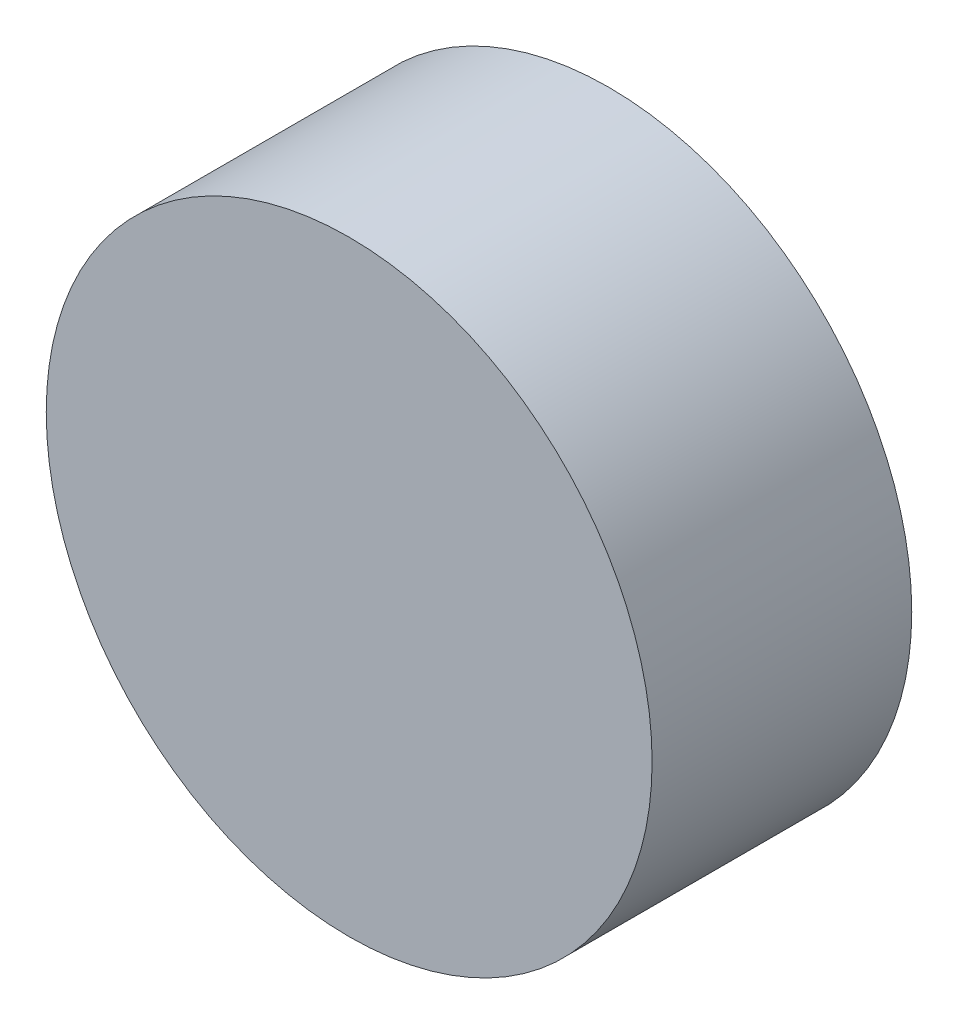
ISO-10303-21;
HEADER;
FILE_DESCRIPTION(('STEP AP214'),'2;1');
FILE_NAME('part.step','',(''),(''),'','','');
FILE_SCHEMA(('AUTOMOTIVE_DESIGN { 1 0 10303 214 1 1 1 1 }'));
ENDSEC;
DATA;
#1=APPLICATION_CONTEXT('core data for automotive mechanical design processes');
#2=APPLICATION_PROTOCOL_DEFINITION('international standard','automotive_design',2000,#1);
#3=PRODUCT_CONTEXT('',#1,'mechanical');
#4=PRODUCT('Part','Part','',(#3));
#5=PRODUCT_RELATED_PRODUCT_CATEGORY('part','',(#4));
#6=PRODUCT_DEFINITION_FORMATION('','',#4);
#7=PRODUCT_DEFINITION_CONTEXT('part definition',#1,'design');
#8=PRODUCT_DEFINITION('design','',#6,#7);
#9=PRODUCT_DEFINITION_SHAPE('','',#8);
#10=(LENGTH_UNIT() NAMED_UNIT(*) SI_UNIT(.MILLI.,.METRE.));
#11=(NAMED_UNIT(*) PLANE_ANGLE_UNIT() SI_UNIT($,.RADIAN.));
#12=(NAMED_UNIT(*) SI_UNIT($,.STERADIAN.) SOLID_ANGLE_UNIT());
#13=UNCERTAINTY_MEASURE_WITH_UNIT(LENGTH_MEASURE(1.E-05),#10,'distance_accuracy_value','');
#14=(GEOMETRIC_REPRESENTATION_CONTEXT(3) GLOBAL_UNCERTAINTY_ASSIGNED_CONTEXT((#13)) GLOBAL_UNIT_ASSIGNED_CONTEXT((#10,
#11,#12)) REPRESENTATION_CONTEXT('',''));
#15=CARTESIAN_POINT('',(0.,0.,0.));
#16=DIRECTION('',(0.,0.,1.));
#17=DIRECTION('',(1.,0.,0.));
#18=AXIS2_PLACEMENT_3D('',#15,#16,#17);
#19=CARTESIAN_POINT('',(0.,0.,3.));
#20=DIRECTION('',(0.,0.,-1.));
#21=DIRECTION('',(-1.,0.,0.));
#22=AXIS2_PLACEMENT_3D('',#19,#20,#21);
#23=CYLINDRICAL_SURFACE('',#22,3.5);
#24=CARTESIAN_POINT('',(0.,0.,3.));
#25=DIRECTION('',(0.,0.,1.));
#26=DIRECTION('',(1.,0.,0.));
#27=AXIS2_PLACEMENT_3D('',#24,#25,#26);
#28=CIRCLE('',#27,3.5);
#29=CARTESIAN_POINT('',(3.5,0.,3.));
#30=VERTEX_POINT('',#29);
#31=EDGE_CURVE('E10',#30,#30,#28,.T.);
#32=ORIENTED_EDGE('',*,*,#31,.F.);
#33=EDGE_LOOP('',(#32));
#34=FACE_BOUND('',#33,.T.);
#35=CARTESIAN_POINT('',(0.,0.,0.));
#36=DIRECTION('',(0.,0.,1.));
#37=DIRECTION('',(1.,0.,0.));
#38=AXIS2_PLACEMENT_3D('',#35,#36,#37);
#39=CIRCLE('',#38,3.5);
#40=CARTESIAN_POINT('',(3.5,0.,0.));
#41=VERTEX_POINT('',#40);
#42=EDGE_CURVE('E34',#41,#41,#39,.T.);
#43=ORIENTED_EDGE('',*,*,#42,.T.);
#44=EDGE_LOOP('',(#43));
#45=FACE_BOUND('',#44,.T.);
#46=ADVANCED_FACE('F31',(#34,#45),#23,.T.);
#47=CARTESIAN_POINT('',(0.,0.,3.));
#48=DIRECTION('',(0.,0.,1.));
#49=DIRECTION('',(1.,0.,0.));
#50=AXIS2_PLACEMENT_3D('',#47,#48,#49);
#51=PLANE('',#50);
#52=ORIENTED_EDGE('',*,*,#31,.T.);
#53=EDGE_LOOP('',(#52));
#54=FACE_BOUND('',#53,.T.);
#55=ADVANCED_FACE('F46',(#54),#51,.T.);
#56=CARTESIAN_POINT('',(0.,0.,0.));
#57=DIRECTION('',(0.,0.,1.));
#58=DIRECTION('',(1.,0.,0.));
#59=AXIS2_PLACEMENT_3D('',#56,#57,#58);
#60=PLANE('',#59);
#61=ORIENTED_EDGE('',*,*,#42,.F.);
#62=EDGE_LOOP('',(#61));
#63=FACE_BOUND('',#62,.T.);
#64=ADVANCED_FACE('F44',(#63),#60,.F.);
#65=CLOSED_SHELL('',(#46,#55,#64));
#66=MANIFOLD_SOLID_BREP('B2',#65);
#67=ADVANCED_BREP_SHAPE_REPRESENTATION('',(#18,#66),#14);
#68=SHAPE_DEFINITION_REPRESENTATION(#9,#67);
ENDSEC;
END-ISO-10303-21;
